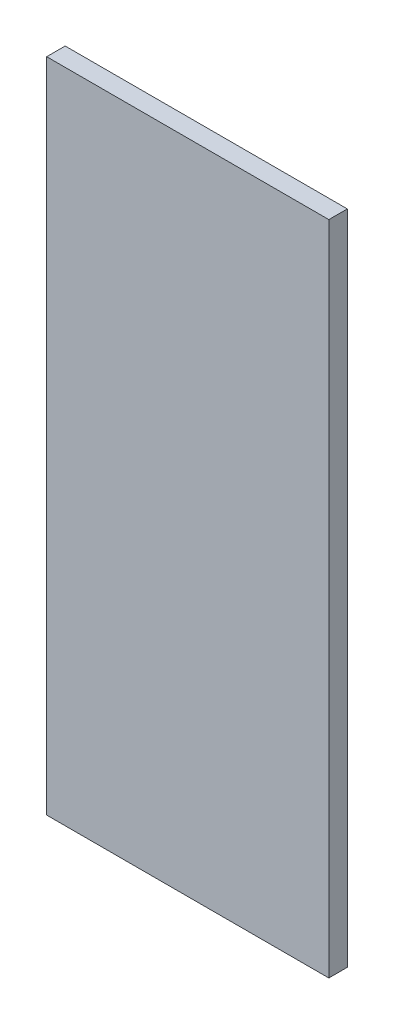
ISO-10303-21;
HEADER;
FILE_DESCRIPTION(('STEP AP214'),'2;1');
FILE_NAME('part.step','',(''),(''),'','','');
FILE_SCHEMA(('AUTOMOTIVE_DESIGN { 1 0 10303 214 1 1 1 1 }'));
ENDSEC;
DATA;
#1=APPLICATION_CONTEXT('core data for automotive mechanical design processes');
#2=APPLICATION_PROTOCOL_DEFINITION('international standard','automotive_design',2000,#1);
#3=PRODUCT_CONTEXT('',#1,'mechanical');
#4=PRODUCT('Part','Part','',(#3));
#5=PRODUCT_RELATED_PRODUCT_CATEGORY('part','',(#4));
#6=PRODUCT_DEFINITION_FORMATION('','',#4);
#7=PRODUCT_DEFINITION_CONTEXT('part definition',#1,'design');
#8=PRODUCT_DEFINITION('design','',#6,#7);
#9=PRODUCT_DEFINITION_SHAPE('','',#8);
#10=(LENGTH_UNIT() NAMED_UNIT(*) SI_UNIT(.MILLI.,.METRE.));
#11=(NAMED_UNIT(*) PLANE_ANGLE_UNIT() SI_UNIT($,.RADIAN.));
#12=(NAMED_UNIT(*) SI_UNIT($,.STERADIAN.) SOLID_ANGLE_UNIT());
#13=UNCERTAINTY_MEASURE_WITH_UNIT(LENGTH_MEASURE(1.E-05),#10,'distance_accuracy_value','');
#14=(GEOMETRIC_REPRESENTATION_CONTEXT(3) GLOBAL_UNCERTAINTY_ASSIGNED_CONTEXT((#13)) GLOBAL_UNIT_ASSIGNED_CONTEXT((#10,
#11,#12)) REPRESENTATION_CONTEXT('',''));
#15=CARTESIAN_POINT('',(0.,0.,0.));
#16=DIRECTION('',(0.,0.,1.));
#17=DIRECTION('',(1.,0.,0.));
#18=AXIS2_PLACEMENT_3D('',#15,#16,#17);
#19=CARTESIAN_POINT('',(0.,0.,4.));
#20=DIRECTION('',(1.,0.,0.));
#21=DIRECTION('',(0.,0.,-1.));
#22=AXIS2_PLACEMENT_3D('',#19,#20,#21);
#23=PLANE('',#22);
#24=DIRECTION('',(0.,-1.,0.));
#25=VECTOR('',#24,1.);
#26=CARTESIAN_POINT('',(0.,0.,0.));
#27=LINE('',#26,#25);
#28=CARTESIAN_POINT('',(0.,142.,0.));
#29=VERTEX_POINT('',#28);
#30=CARTESIAN_POINT('',(0.,0.,0.));
#31=VERTEX_POINT('',#30);
#32=EDGE_CURVE('E113',#29,#31,#27,.T.);
#33=ORIENTED_EDGE('',*,*,#32,.T.);
#34=DIRECTION('',(0.,0.,-1.));
#35=VECTOR('',#34,1.);
#36=CARTESIAN_POINT('',(0.,0.,4.));
#37=LINE('',#36,#35);
#38=CARTESIAN_POINT('',(0.,0.,4.));
#39=VERTEX_POINT('',#38);
#40=EDGE_CURVE('E11',#39,#31,#37,.T.);
#41=ORIENTED_EDGE('',*,*,#40,.F.);
#42=DIRECTION('',(0.,-1.,0.));
#43=VECTOR('',#42,1.);
#44=CARTESIAN_POINT('',(0.,0.,4.));
#45=LINE('',#44,#43);
#46=CARTESIAN_POINT('',(0.,142.,4.));
#47=VERTEX_POINT('',#46);
#48=EDGE_CURVE('E97',#47,#39,#45,.T.);
#49=ORIENTED_EDGE('',*,*,#48,.F.);
#50=DIRECTION('',(0.,0.,-1.));
#51=VECTOR('',#50,1.);
#52=CARTESIAN_POINT('',(0.,142.,4.));
#53=LINE('',#52,#51);
#54=EDGE_CURVE('E109',#47,#29,#53,.T.);
#55=ORIENTED_EDGE('',*,*,#54,.T.);
#56=EDGE_LOOP('',(#33,#41,#49,#55));
#57=FACE_BOUND('',#56,.T.);
#58=ADVANCED_FACE('F45',(#57),#23,.F.);
#59=CARTESIAN_POINT('',(0.,0.,4.));
#60=DIRECTION('',(0.,1.,0.));
#61=DIRECTION('',(0.,0.,1.));
#62=AXIS2_PLACEMENT_3D('',#59,#60,#61);
#63=PLANE('',#62);
#64=DIRECTION('',(1.,0.,0.));
#65=VECTOR('',#64,1.);
#66=CARTESIAN_POINT('',(0.,0.,0.));
#67=LINE('',#66,#65);
#68=CARTESIAN_POINT('',(61.,0.,0.));
#69=VERTEX_POINT('',#68);
#70=EDGE_CURVE('E102',#31,#69,#67,.T.);
#71=ORIENTED_EDGE('',*,*,#70,.T.);
#72=DIRECTION('',(0.,0.,-1.));
#73=VECTOR('',#72,1.);
#74=CARTESIAN_POINT('',(61.,0.,4.));
#75=LINE('',#74,#73);
#76=CARTESIAN_POINT('',(61.,0.,4.));
#77=VERTEX_POINT('',#76);
#78=EDGE_CURVE('E54',#77,#69,#75,.T.);
#79=ORIENTED_EDGE('',*,*,#78,.F.);
#80=DIRECTION('',(1.,0.,0.));
#81=VECTOR('',#80,1.);
#82=CARTESIAN_POINT('',(0.,0.,4.));
#83=LINE('',#82,#81);
#84=EDGE_CURVE('E92',#39,#77,#83,.T.);
#85=ORIENTED_EDGE('',*,*,#84,.F.);
#86=ORIENTED_EDGE('',*,*,#40,.T.);
#87=EDGE_LOOP('',(#71,#79,#85,#86));
#88=FACE_BOUND('',#87,.T.);
#89=ADVANCED_FACE('F101',(#88),#63,.F.);
#90=CARTESIAN_POINT('',(61.,0.,4.));
#91=DIRECTION('',(-1.,0.,0.));
#92=DIRECTION('',(0.,0.,1.));
#93=AXIS2_PLACEMENT_3D('',#90,#91,#92);
#94=PLANE('',#93);
#95=DIRECTION('',(0.,1.,0.));
#96=VECTOR('',#95,1.);
#97=CARTESIAN_POINT('',(61.,0.,0.));
#98=LINE('',#97,#96);
#99=CARTESIAN_POINT('',(61.,142.,0.));
#100=VERTEX_POINT('',#99);
#101=EDGE_CURVE('E79',#69,#100,#98,.T.);
#102=ORIENTED_EDGE('',*,*,#101,.T.);
#103=DIRECTION('',(0.,0.,-1.));
#104=VECTOR('',#103,1.);
#105=CARTESIAN_POINT('',(61.,142.,4.));
#106=LINE('',#105,#104);
#107=CARTESIAN_POINT('',(61.,142.,4.));
#108=VERTEX_POINT('',#107);
#109=EDGE_CURVE('E104',#108,#100,#106,.T.);
#110=ORIENTED_EDGE('',*,*,#109,.F.);
#111=DIRECTION('',(0.,1.,0.));
#112=VECTOR('',#111,1.);
#113=CARTESIAN_POINT('',(61.,0.,4.));
#114=LINE('',#113,#112);
#115=EDGE_CURVE('E95',#77,#108,#114,.T.);
#116=ORIENTED_EDGE('',*,*,#115,.F.);
#117=ORIENTED_EDGE('',*,*,#78,.T.);
#118=EDGE_LOOP('',(#102,#110,#116,#117));
#119=FACE_BOUND('',#118,.T.);
#120=ADVANCED_FACE('F105',(#119),#94,.F.);
#121=CARTESIAN_POINT('',(0.,142.,4.));
#122=DIRECTION('',(0.,-1.,0.));
#123=DIRECTION('',(0.,0.,-1.));
#124=AXIS2_PLACEMENT_3D('',#121,#122,#123);
#125=PLANE('',#124);
#126=DIRECTION('',(-1.,0.,0.));
#127=VECTOR('',#126,1.);
#128=CARTESIAN_POINT('',(0.,142.,0.));
#129=LINE('',#128,#127);
#130=EDGE_CURVE('E85',#100,#29,#129,.T.);
#131=ORIENTED_EDGE('',*,*,#130,.T.);
#132=ORIENTED_EDGE('',*,*,#54,.F.);
#133=DIRECTION('',(-1.,0.,0.));
#134=VECTOR('',#133,1.);
#135=CARTESIAN_POINT('',(0.,142.,4.));
#136=LINE('',#135,#134);
#137=EDGE_CURVE('E62',#108,#47,#136,.T.);
#138=ORIENTED_EDGE('',*,*,#137,.F.);
#139=ORIENTED_EDGE('',*,*,#109,.T.);
#140=EDGE_LOOP('',(#131,#132,#138,#139));
#141=FACE_BOUND('',#140,.T.);
#142=ADVANCED_FACE('F126',(#141),#125,.F.);
#143=CARTESIAN_POINT('',(0.,0.,4.));
#144=DIRECTION('',(0.,0.,-1.));
#145=DIRECTION('',(-1.,0.,0.));
#146=AXIS2_PLACEMENT_3D('',#143,#144,#145);
#147=PLANE('',#146);
#148=ORIENTED_EDGE('',*,*,#48,.T.);
#149=ORIENTED_EDGE('',*,*,#84,.T.);
#150=ORIENTED_EDGE('',*,*,#115,.T.);
#151=ORIENTED_EDGE('',*,*,#137,.T.);
#152=EDGE_LOOP('',(#148,#149,#150,#151));
#153=FACE_BOUND('',#152,.T.);
#154=ADVANCED_FACE('F93',(#153),#147,.F.);
#155=CARTESIAN_POINT('',(0.,0.,0.));
#156=DIRECTION('',(0.,0.,-1.));
#157=DIRECTION('',(-1.,0.,0.));
#158=AXIS2_PLACEMENT_3D('',#155,#156,#157);
#159=PLANE('',#158);
#160=ORIENTED_EDGE('',*,*,#32,.F.);
#161=ORIENTED_EDGE('',*,*,#130,.F.);
#162=ORIENTED_EDGE('',*,*,#101,.F.);
#163=ORIENTED_EDGE('',*,*,#70,.F.);
#164=EDGE_LOOP('',(#160,#161,#162,#163));
#165=FACE_BOUND('',#164,.T.);
#166=ADVANCED_FACE('F129',(#165),#159,.T.);
#167=CLOSED_SHELL('',(#58,#89,#120,#142,#154,#166));
#168=MANIFOLD_SOLID_BREP('B2',#167);
#169=ADVANCED_BREP_SHAPE_REPRESENTATION('',(#18,#168),#14);
#170=SHAPE_DEFINITION_REPRESENTATION(#9,#169);
ENDSEC;
END-ISO-10303-21;
